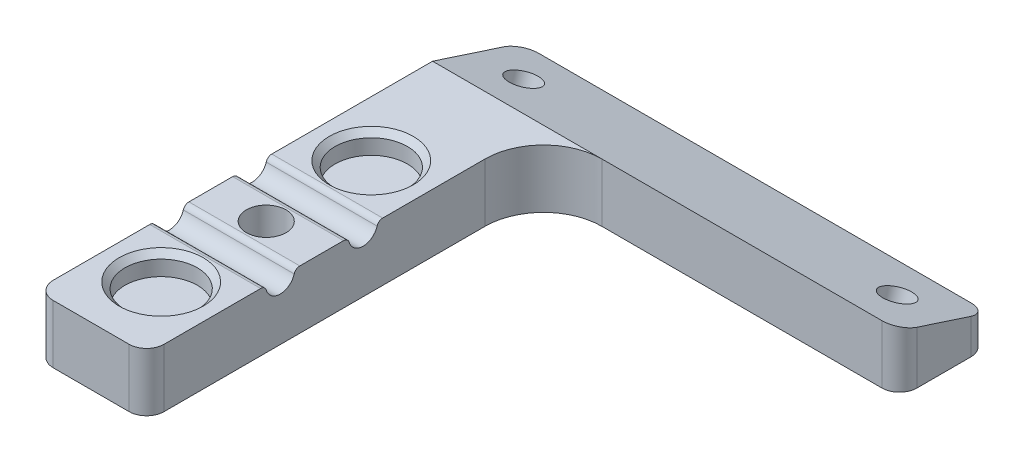
ISO-10303-21;
HEADER;
FILE_DESCRIPTION(('STEP AP214'),'2;1');
FILE_NAME('part.step','',(''),(''),'','','');
FILE_SCHEMA(('AUTOMOTIVE_DESIGN { 1 0 10303 214 1 1 1 1 }'));
ENDSEC;
DATA;
#1=APPLICATION_CONTEXT('core data for automotive mechanical design processes');
#2=APPLICATION_PROTOCOL_DEFINITION('international standard','automotive_design',2000,#1);
#3=PRODUCT_CONTEXT('',#1,'mechanical');
#4=PRODUCT('Part','Part','',(#3));
#5=PRODUCT_RELATED_PRODUCT_CATEGORY('part','',(#4));
#6=PRODUCT_DEFINITION_FORMATION('','',#4);
#7=PRODUCT_DEFINITION_CONTEXT('part definition',#1,'design');
#8=PRODUCT_DEFINITION('design','',#6,#7);
#9=PRODUCT_DEFINITION_SHAPE('','',#8);
#10=(LENGTH_UNIT() NAMED_UNIT(*) SI_UNIT(.MILLI.,.METRE.));
#11=(NAMED_UNIT(*) PLANE_ANGLE_UNIT() SI_UNIT($,.RADIAN.));
#12=(NAMED_UNIT(*) SI_UNIT($,.STERADIAN.) SOLID_ANGLE_UNIT());
#13=UNCERTAINTY_MEASURE_WITH_UNIT(LENGTH_MEASURE(1.E-05),#10,'distance_accuracy_value','');
#14=(GEOMETRIC_REPRESENTATION_CONTEXT(3) GLOBAL_UNCERTAINTY_ASSIGNED_CONTEXT((#13)) GLOBAL_UNIT_ASSIGNED_CONTEXT((#10,
#11,#12)) REPRESENTATION_CONTEXT('',''));
#15=CARTESIAN_POINT('',(0.,0.,0.));
#16=DIRECTION('',(0.,0.,1.));
#17=DIRECTION('',(1.,0.,0.));
#18=AXIS2_PLACEMENT_3D('',#15,#16,#17);
#19=CARTESIAN_POINT('',(0.,5.,0.));
#20=DIRECTION('',(0.,-1.,0.));
#21=DIRECTION('',(0.,0.,-1.));
#22=AXIS2_PLACEMENT_3D('',#19,#20,#21);
#23=PLANE('',#22);
#24=CARTESIAN_POINT('',(0.,5.,9.));
#25=DIRECTION('',(0.,-1.,0.));
#26=DIRECTION('',(0.,0.,-1.));
#27=AXIS2_PLACEMENT_3D('',#24,#25,#26);
#28=CIRCLE('',#27,3.60000000000001);
#29=CARTESIAN_POINT('',(0.,5.,5.4));
#30=VERTEX_POINT('',#29);
#31=EDGE_CURVE('E249',#30,#30,#28,.T.);
#32=ORIENTED_EDGE('',*,*,#31,.T.);
#33=EDGE_LOOP('',(#32));
#34=FACE_BOUND('',#33,.T.);
#35=DIRECTION('',(0.,0.,-1.));
#36=VECTOR('',#35,1.);
#37=CARTESIAN_POINT('',(4.75,5.,15.));
#38=LINE('',#37,#36);
#39=CARTESIAN_POINT('',(4.75,5.,13.5));
#40=VERTEX_POINT('',#39);
#41=CARTESIAN_POINT('',(4.75,5.,5.22705098312484));
#42=VERTEX_POINT('',#41);
#43=EDGE_CURVE('E214',#40,#42,#38,.T.);
#44=ORIENTED_EDGE('',*,*,#43,.T.);
#45=DIRECTION('',(-1.,0.,0.));
#46=VECTOR('',#45,1.);
#47=CARTESIAN_POINT('',(0.,5.,5.22705098312484));
#48=LINE('',#47,#46);
#49=CARTESIAN_POINT('',(-4.75,5.,5.22705098312484));
#50=VERTEX_POINT('',#49);
#51=EDGE_CURVE('E314',#42,#50,#48,.T.);
#52=ORIENTED_EDGE('',*,*,#51,.T.);
#53=DIRECTION('',(0.,0.,1.));
#54=VECTOR('',#53,1.);
#55=CARTESIAN_POINT('',(-4.75,5.,15.));
#56=LINE('',#55,#54);
#57=CARTESIAN_POINT('',(-4.75,5.,13.5));
#58=VERTEX_POINT('',#57);
#59=EDGE_CURVE('E208',#50,#58,#56,.T.);
#60=ORIENTED_EDGE('',*,*,#59,.T.);
#61=CARTESIAN_POINT('',(-3.25,5.,13.5));
#62=DIRECTION('',(0.,-1.,0.));
#63=DIRECTION('',(0.,0.,-1.));
#64=AXIS2_PLACEMENT_3D('',#61,#62,#63);
#65=CIRCLE('',#64,1.5);
#66=CARTESIAN_POINT('',(-3.25,5.,15.));
#67=VERTEX_POINT('',#66);
#68=EDGE_CURVE('E293',#58,#67,#65,.F.);
#69=ORIENTED_EDGE('',*,*,#68,.T.);
#70=DIRECTION('',(1.,0.,0.));
#71=VECTOR('',#70,1.);
#72=CARTESIAN_POINT('',(-4.75,5.,15.));
#73=LINE('',#72,#71);
#74=CARTESIAN_POINT('',(3.25,5.,15.));
#75=VERTEX_POINT('',#74);
#76=EDGE_CURVE('E205',#67,#75,#73,.T.);
#77=ORIENTED_EDGE('',*,*,#76,.T.);
#78=CARTESIAN_POINT('',(3.25,5.,13.5));
#79=DIRECTION('',(0.,-1.,0.));
#80=DIRECTION('',(0.,0.,-1.));
#81=AXIS2_PLACEMENT_3D('',#78,#79,#80);
#82=CIRCLE('',#81,1.5);
#83=EDGE_CURVE('E291',#75,#40,#82,.F.);
#84=ORIENTED_EDGE('',*,*,#83,.T.);
#85=EDGE_LOOP('',(#44,#52,#60,#69,#77,#84));
#86=FACE_BOUND('',#85,.T.);
#87=ADVANCED_FACE('F36',(#34,#86),#23,.F.);
#88=CARTESIAN_POINT('',(0.,5.,0.));
#89=DIRECTION('',(0.,1.,0.));
#90=DIRECTION('',(0.,0.,1.));
#91=AXIS2_PLACEMENT_3D('',#88,#89,#90);
#92=CIRCLE('',#91,1.7);
#93=CARTESIAN_POINT('',(0.,5.,1.7));
#94=VERTEX_POINT('',#93);
#95=EDGE_CURVE('E371',#94,#94,#92,.T.);
#96=ORIENTED_EDGE('',*,*,#95,.F.);
#97=EDGE_LOOP('',(#96));
#98=FACE_BOUND('',#97,.T.);
#99=CARTESIAN_POINT('',(-4.75,5.,-1.87294901687516));
#100=VERTEX_POINT('',#99);
#101=CARTESIAN_POINT('',(-4.75,5.,1.87294901687516));
#102=VERTEX_POINT('',#101);
#103=EDGE_CURVE('E206',#100,#102,#56,.T.);
#104=ORIENTED_EDGE('',*,*,#103,.T.);
#105=DIRECTION('',(-1.,0.,0.));
#106=VECTOR('',#105,1.);
#107=CARTESIAN_POINT('',(0.,5.,1.87294901687516));
#108=LINE('',#107,#106);
#109=CARTESIAN_POINT('',(4.75,5.,1.87294901687516));
#110=VERTEX_POINT('',#109);
#111=EDGE_CURVE('E337',#102,#110,#108,.F.);
#112=ORIENTED_EDGE('',*,*,#111,.T.);
#113=CARTESIAN_POINT('',(4.75,5.,-1.87294901687516));
#114=VERTEX_POINT('',#113);
#115=EDGE_CURVE('E219',#110,#114,#38,.T.);
#116=ORIENTED_EDGE('',*,*,#115,.T.);
#117=DIRECTION('',(-1.,0.,0.));
#118=VECTOR('',#117,1.);
#119=CARTESIAN_POINT('',(0.,5.,-1.87294901687516));
#120=LINE('',#119,#118);
#121=EDGE_CURVE('E334',#114,#100,#120,.T.);
#122=ORIENTED_EDGE('',*,*,#121,.T.);
#123=EDGE_LOOP('',(#104,#112,#116,#122));
#124=FACE_BOUND('',#123,.T.);
#125=ADVANCED_FACE('F380',(#98,#124),#23,.F.);
#126=CARTESIAN_POINT('',(0.,0.,0.));
#127=DIRECTION('',(0.,1.,0.));
#128=DIRECTION('',(0.,0.,1.));
#129=AXIS2_PLACEMENT_3D('',#126,#127,#128);
#130=CYLINDRICAL_SURFACE('',#129,1.7);
#131=ORIENTED_EDGE('',*,*,#95,.T.);
#132=EDGE_LOOP('',(#131));
#133=FACE_BOUND('',#132,.T.);
#134=CARTESIAN_POINT('',(0.,2.,0.));
#135=DIRECTION('',(0.,-1.,0.));
#136=DIRECTION('',(0.,0.,-1.));
#137=AXIS2_PLACEMENT_3D('',#134,#135,#136);
#138=CIRCLE('',#137,1.7);
#139=CARTESIAN_POINT('',(0.,2.,-1.7));
#140=VERTEX_POINT('',#139);
#141=EDGE_CURVE('E307',#140,#140,#138,.F.);
#142=ORIENTED_EDGE('',*,*,#141,.F.);
#143=EDGE_LOOP('',(#142));
#144=FACE_BOUND('',#143,.T.);
#145=ADVANCED_FACE('F377',(#133,#144),#130,.F.);
#146=CARTESIAN_POINT('',(0.,0.,-9.));
#147=DIRECTION('',(0.,1.,0.));
#148=DIRECTION('',(0.,0.,1.));
#149=AXIS2_PLACEMENT_3D('',#146,#147,#148);
#150=CYLINDRICAL_SURFACE('',#149,3.1);
#151=CARTESIAN_POINT('',(0.,4.5,-9.));
#152=DIRECTION('',(0.,-1.,0.));
#153=DIRECTION('',(0.,0.,-1.));
#154=AXIS2_PLACEMENT_3D('',#151,#152,#153);
#155=CIRCLE('',#154,3.1);
#156=CARTESIAN_POINT('',(0.,4.5,-12.1));
#157=VERTEX_POINT('',#156);
#158=EDGE_CURVE('E252',#157,#157,#155,.F.);
#159=ORIENTED_EDGE('',*,*,#158,.T.);
#160=EDGE_LOOP('',(#159));
#161=FACE_BOUND('',#160,.T.);
#162=CARTESIAN_POINT('',(0.,3.2,-9.));
#163=DIRECTION('',(0.,-1.,0.));
#164=DIRECTION('',(0.,0.,-1.));
#165=AXIS2_PLACEMENT_3D('',#162,#163,#164);
#166=CIRCLE('',#165,3.1);
#167=CARTESIAN_POINT('',(0.,3.2,-12.1));
#168=VERTEX_POINT('',#167);
#169=EDGE_CURVE('E240',#168,#168,#166,.F.);
#170=ORIENTED_EDGE('',*,*,#169,.F.);
#171=EDGE_LOOP('',(#170));
#172=FACE_BOUND('',#171,.T.);
#173=ADVANCED_FACE('F485',(#161,#172),#150,.F.);
#174=CARTESIAN_POINT('',(0.,0.,9.));
#175=DIRECTION('',(0.,1.,0.));
#176=DIRECTION('',(0.,0.,1.));
#177=AXIS2_PLACEMENT_3D('',#174,#175,#176);
#178=CYLINDRICAL_SURFACE('',#177,3.1);
#179=CARTESIAN_POINT('',(0.,4.5,9.));
#180=DIRECTION('',(0.,-1.,0.));
#181=DIRECTION('',(0.,0.,-1.));
#182=AXIS2_PLACEMENT_3D('',#179,#180,#181);
#183=CIRCLE('',#182,3.1);
#184=CARTESIAN_POINT('',(0.,4.5,5.9));
#185=VERTEX_POINT('',#184);
#186=EDGE_CURVE('E243',#185,#185,#183,.F.);
#187=ORIENTED_EDGE('',*,*,#186,.T.);
#188=EDGE_LOOP('',(#187));
#189=FACE_BOUND('',#188,.T.);
#190=CARTESIAN_POINT('',(0.,3.2,9.));
#191=DIRECTION('',(0.,-1.,0.));
#192=DIRECTION('',(0.,0.,-1.));
#193=AXIS2_PLACEMENT_3D('',#190,#191,#192);
#194=CIRCLE('',#193,3.1);
#195=CARTESIAN_POINT('',(0.,3.2,5.9));
#196=VERTEX_POINT('',#195);
#197=EDGE_CURVE('E210',#196,#196,#194,.F.);
#198=ORIENTED_EDGE('',*,*,#197,.F.);
#199=EDGE_LOOP('',(#198));
#200=FACE_BOUND('',#199,.T.);
#201=ADVANCED_FACE('F488',(#189,#200),#178,.F.);
#202=CARTESIAN_POINT('',(4.75,5.,15.));
#203=DIRECTION('',(-1.,0.,0.));
#204=DIRECTION('',(0.,0.,1.));
#205=AXIS2_PLACEMENT_3D('',#202,#203,#204);
#206=PLANE('',#205);
#207=CARTESIAN_POINT('',(4.75,5.,3.55));
#208=DIRECTION('',(-1.,0.,0.));
#209=DIRECTION('',(0.,0.,1.));
#210=AXIS2_PLACEMENT_3D('',#207,#208,#209);
#211=CIRCLE('',#210,1.25);
#212=CARTESIAN_POINT('',(4.75,4.64285714285714,2.35210644062511));
#213=VERTEX_POINT('',#212);
#214=CARTESIAN_POINT('',(4.75,4.64285714285714,4.74789355937489));
#215=VERTEX_POINT('',#214);
#216=EDGE_CURVE('E347',#213,#215,#211,.T.);
#217=ORIENTED_EDGE('',*,*,#216,.T.);
#218=CARTESIAN_POINT('',(4.75,4.5,5.22705098312484));
#219=DIRECTION('',(-1.,0.,0.));
#220=DIRECTION('',(0.,0.,1.));
#221=AXIS2_PLACEMENT_3D('',#218,#219,#220);
#222=CIRCLE('',#221,0.5);
#223=EDGE_CURVE('E332',#215,#42,#222,.F.);
#224=ORIENTED_EDGE('',*,*,#223,.T.);
#225=ORIENTED_EDGE('',*,*,#43,.F.);
#226=DIRECTION('',(0.,-1.,0.));
#227=VECTOR('',#226,1.);
#228=CARTESIAN_POINT('',(4.75,5.,13.5));
#229=LINE('',#228,#227);
#230=CARTESIAN_POINT('',(4.75,0.,13.5));
#231=VERTEX_POINT('',#230);
#232=EDGE_CURVE('E295',#40,#231,#229,.T.);
#233=ORIENTED_EDGE('',*,*,#232,.T.);
#234=DIRECTION('',(0.,0.,-1.));
#235=VECTOR('',#234,1.);
#236=CARTESIAN_POINT('',(4.75,0.,15.));
#237=LINE('',#236,#235);
#238=CARTESIAN_POINT('',(4.75,0.,-14.));
#239=VERTEX_POINT('',#238);
#240=EDGE_CURVE('E234',#231,#239,#237,.T.);
#241=ORIENTED_EDGE('',*,*,#240,.T.);
#242=DIRECTION('',(0.,1.,0.));
#243=VECTOR('',#242,1.);
#244=CARTESIAN_POINT('',(4.75,5.,-14.));
#245=LINE('',#244,#243);
#246=CARTESIAN_POINT('',(4.75,5.,-14.));
#247=VERTEX_POINT('',#246);
#248=EDGE_CURVE('E298',#239,#247,#245,.T.);
#249=ORIENTED_EDGE('',*,*,#248,.T.);
#250=CARTESIAN_POINT('',(4.75,5.,-5.22705098312484));
#251=VERTEX_POINT('',#250);
#252=EDGE_CURVE('E220',#251,#247,#38,.T.);
#253=ORIENTED_EDGE('',*,*,#252,.F.);
#254=CARTESIAN_POINT('',(4.75,4.5,-5.22705098312484));
#255=DIRECTION('',(-1.,0.,0.));
#256=DIRECTION('',(0.,0.,1.));
#257=AXIS2_PLACEMENT_3D('',#254,#255,#256);
#258=CIRCLE('',#257,0.5);
#259=CARTESIAN_POINT('',(4.75,4.64285714285714,-4.74789355937489));
#260=VERTEX_POINT('',#259);
#261=EDGE_CURVE('E57',#251,#260,#258,.F.);
#262=ORIENTED_EDGE('',*,*,#261,.T.);
#263=CARTESIAN_POINT('',(4.75,5.,-3.55));
#264=DIRECTION('',(-1.,0.,0.));
#265=DIRECTION('',(0.,0.,1.));
#266=AXIS2_PLACEMENT_3D('',#263,#264,#265);
#267=CIRCLE('',#266,1.25);
#268=CARTESIAN_POINT('',(4.75,4.64285714285714,-2.35210644062511));
#269=VERTEX_POINT('',#268);
#270=EDGE_CURVE('E344',#260,#269,#267,.T.);
#271=ORIENTED_EDGE('',*,*,#270,.T.);
#272=CARTESIAN_POINT('',(4.75,4.5,-1.87294901687516));
#273=DIRECTION('',(-1.,0.,0.));
#274=DIRECTION('',(0.,0.,1.));
#275=AXIS2_PLACEMENT_3D('',#272,#273,#274);
#276=CIRCLE('',#275,0.5);
#277=EDGE_CURVE('E328',#269,#114,#276,.F.);
#278=ORIENTED_EDGE('',*,*,#277,.T.);
#279=ORIENTED_EDGE('',*,*,#115,.F.);
#280=CARTESIAN_POINT('',(4.75,4.5,1.87294901687516));
#281=DIRECTION('',(-1.,0.,0.));
#282=DIRECTION('',(0.,0.,1.));
#283=AXIS2_PLACEMENT_3D('',#280,#281,#282);
#284=CIRCLE('',#283,0.5);
#285=EDGE_CURVE('E330',#110,#213,#284,.F.);
#286=ORIENTED_EDGE('',*,*,#285,.T.);
#287=EDGE_LOOP('',(#217,#224,#225,#233,#241,#249,#253,#262,#271,#278,#279,#286));
#288=FACE_BOUND('',#287,.T.);
#289=ADVANCED_FACE('F350',(#288),#206,.F.);
#290=CARTESIAN_POINT('',(-4.75,5.,15.));
#291=DIRECTION('',(1.,0.,0.));
#292=DIRECTION('',(0.,0.,-1.));
#293=AXIS2_PLACEMENT_3D('',#290,#291,#292);
#294=PLANE('',#293);
#295=ORIENTED_EDGE('',*,*,#59,.F.);
#296=CARTESIAN_POINT('',(-4.75,4.5,5.22705098312484));
#297=DIRECTION('',(1.,0.,0.));
#298=DIRECTION('',(0.,0.,-1.));
#299=AXIS2_PLACEMENT_3D('',#296,#297,#298);
#300=CIRCLE('',#299,0.5);
#301=CARTESIAN_POINT('',(-4.75,4.64285714285714,4.74789355937489));
#302=VERTEX_POINT('',#301);
#303=EDGE_CURVE('E321',#50,#302,#300,.F.);
#304=ORIENTED_EDGE('',*,*,#303,.T.);
#305=CARTESIAN_POINT('',(-4.75,5.,3.55));
#306=DIRECTION('',(1.,0.,0.));
#307=DIRECTION('',(0.,0.,-1.));
#308=AXIS2_PLACEMENT_3D('',#305,#306,#307);
#309=CIRCLE('',#308,1.25);
#310=CARTESIAN_POINT('',(-4.75,4.64285714285714,2.35210644062511));
#311=VERTEX_POINT('',#310);
#312=EDGE_CURVE('E306',#302,#311,#309,.T.);
#313=ORIENTED_EDGE('',*,*,#312,.T.);
#314=CARTESIAN_POINT('',(-4.75,4.5,1.87294901687516));
#315=DIRECTION('',(1.,0.,0.));
#316=DIRECTION('',(0.,0.,-1.));
#317=AXIS2_PLACEMENT_3D('',#314,#315,#316);
#318=CIRCLE('',#317,0.5);
#319=EDGE_CURVE('E319',#311,#102,#318,.F.);
#320=ORIENTED_EDGE('',*,*,#319,.T.);
#321=ORIENTED_EDGE('',*,*,#103,.F.);
#322=CARTESIAN_POINT('',(-4.75,4.5,-1.87294901687516));
#323=DIRECTION('',(1.,0.,0.));
#324=DIRECTION('',(0.,0.,-1.));
#325=AXIS2_PLACEMENT_3D('',#322,#323,#324);
#326=CIRCLE('',#325,0.5);
#327=CARTESIAN_POINT('',(-4.75,4.64285714285714,-2.35210644062511));
#328=VERTEX_POINT('',#327);
#329=EDGE_CURVE('E317',#100,#328,#326,.F.);
#330=ORIENTED_EDGE('',*,*,#329,.T.);
#331=CARTESIAN_POINT('',(-4.75,5.,-3.55));
#332=DIRECTION('',(-1.,0.,0.));
#333=DIRECTION('',(0.,0.,1.));
#334=AXIS2_PLACEMENT_3D('',#331,#332,#333);
#335=CIRCLE('',#334,1.25);
#336=CARTESIAN_POINT('',(-4.75,4.64285714285714,-4.74789355937489));
#337=VERTEX_POINT('',#336);
#338=EDGE_CURVE('E343',#337,#328,#335,.T.);
#339=ORIENTED_EDGE('',*,*,#338,.F.);
#340=CARTESIAN_POINT('',(-4.75,4.5,-5.22705098312484));
#341=DIRECTION('',(1.,0.,0.));
#342=DIRECTION('',(0.,0.,-1.));
#343=AXIS2_PLACEMENT_3D('',#340,#341,#342);
#344=CIRCLE('',#343,0.5);
#345=CARTESIAN_POINT('',(-4.75,5.,-5.22705098312484));
#346=VERTEX_POINT('',#345);
#347=EDGE_CURVE('E204',#337,#346,#344,.F.);
#348=ORIENTED_EDGE('',*,*,#347,.T.);
#349=CARTESIAN_POINT('',(-4.75,5.,-19.));
#350=VERTEX_POINT('',#349);
#351=EDGE_CURVE('E193',#350,#346,#56,.T.);
#352=ORIENTED_EDGE('',*,*,#351,.F.);
#353=DIRECTION('',(0.,-0.309016994374941,-0.951056516295156));
#354=VECTOR('',#353,1.);
#355=CARTESIAN_POINT('',(-4.75,5.,-19.));
#356=LINE('',#355,#354);
#357=CARTESIAN_POINT('',(-4.75,3.01524358934982,-25.1084521303613));
#358=VERTEX_POINT('',#357);
#359=EDGE_CURVE('E175',#350,#358,#356,.T.);
#360=ORIENTED_EDGE('',*,*,#359,.T.);
#361=DIRECTION('',(0.,-1.,0.));
#362=VECTOR('',#361,1.);
#363=CARTESIAN_POINT('',(-4.75,5.,-25.1084521303613));
#364=LINE('',#363,#362);
#365=CARTESIAN_POINT('',(-4.75,0.,-25.1084521303613));
#366=VERTEX_POINT('',#365);
#367=EDGE_CURVE('E257',#358,#366,#364,.T.);
#368=ORIENTED_EDGE('',*,*,#367,.T.);
#369=DIRECTION('',(0.,0.,1.));
#370=VECTOR('',#369,1.);
#371=CARTESIAN_POINT('',(-4.75,0.,15.));
#372=LINE('',#371,#370);
#373=CARTESIAN_POINT('',(-4.75,0.,13.5));
#374=VERTEX_POINT('',#373);
#375=EDGE_CURVE('E227',#366,#374,#372,.T.);
#376=ORIENTED_EDGE('',*,*,#375,.T.);
#377=DIRECTION('',(0.,-1.,0.));
#378=VECTOR('',#377,1.);
#379=CARTESIAN_POINT('',(-4.75,5.,13.5));
#380=LINE('',#379,#378);
#381=EDGE_CURVE('E255',#374,#58,#380,.F.);
#382=ORIENTED_EDGE('',*,*,#381,.T.);
#383=EDGE_LOOP('',(#295,#304,#313,#320,#321,#330,#339,#348,#352,#360,#368,#376,#382));
#384=FACE_BOUND('',#383,.T.);
#385=ADVANCED_FACE('F201',(#384),#294,.F.);
#386=CARTESIAN_POINT('',(-4.75,5.,15.));
#387=DIRECTION('',(0.,0.,-1.));
#388=DIRECTION('',(-1.,0.,0.));
#389=AXIS2_PLACEMENT_3D('',#386,#387,#388);
#390=PLANE('',#389);
#391=ORIENTED_EDGE('',*,*,#76,.F.);
#392=DIRECTION('',(0.,-1.,0.));
#393=VECTOR('',#392,1.);
#394=CARTESIAN_POINT('',(-3.25,5.,15.));
#395=LINE('',#394,#393);
#396=CARTESIAN_POINT('',(-3.25,0.,15.));
#397=VERTEX_POINT('',#396);
#398=EDGE_CURVE('E289',#67,#397,#395,.T.);
#399=ORIENTED_EDGE('',*,*,#398,.T.);
#400=DIRECTION('',(1.,0.,0.));
#401=VECTOR('',#400,1.);
#402=CARTESIAN_POINT('',(-4.75,0.,15.));
#403=LINE('',#402,#401);
#404=CARTESIAN_POINT('',(3.25,0.,15.));
#405=VERTEX_POINT('',#404);
#406=EDGE_CURVE('E225',#397,#405,#403,.T.);
#407=ORIENTED_EDGE('',*,*,#406,.T.);
#408=DIRECTION('',(0.,-1.,0.));
#409=VECTOR('',#408,1.);
#410=CARTESIAN_POINT('',(3.25,5.,15.));
#411=LINE('',#410,#409);
#412=EDGE_CURVE('E287',#405,#75,#411,.F.);
#413=ORIENTED_EDGE('',*,*,#412,.T.);
#414=EDGE_LOOP('',(#391,#399,#407,#413));
#415=FACE_BOUND('',#414,.T.);
#416=ADVANCED_FACE('F445',(#415),#390,.F.);
#417=CARTESIAN_POINT('',(0.,5.,-9.));
#418=DIRECTION('',(0.,-1.,0.));
#419=DIRECTION('',(0.,0.,-1.));
#420=AXIS2_PLACEMENT_3D('',#417,#418,#419);
#421=CIRCLE('',#420,3.60000000000001);
#422=CARTESIAN_POINT('',(0.,5.,-12.6));
#423=VERTEX_POINT('',#422);
#424=EDGE_CURVE('E246',#423,#423,#421,.T.);
#425=ORIENTED_EDGE('',*,*,#424,.T.);
#426=EDGE_LOOP('',(#425));
#427=FACE_BOUND('',#426,.T.);
#428=ORIENTED_EDGE('',*,*,#351,.T.);
#429=DIRECTION('',(-1.,0.,0.));
#430=VECTOR('',#429,1.);
#431=CARTESIAN_POINT('',(0.,5.,-5.22705098312484));
#432=LINE('',#431,#430);
#433=EDGE_CURVE('E12',#346,#251,#432,.F.);
#434=ORIENTED_EDGE('',*,*,#433,.T.);
#435=ORIENTED_EDGE('',*,*,#252,.T.);
#436=CARTESIAN_POINT('',(9.75,5.,-14.));
#437=DIRECTION('',(0.,-1.,0.));
#438=DIRECTION('',(0.,0.,-1.));
#439=AXIS2_PLACEMENT_3D('',#436,#437,#438);
#440=CIRCLE('',#439,5.);
#441=CARTESIAN_POINT('',(9.75,5.,-19.));
#442=VERTEX_POINT('',#441);
#443=EDGE_CURVE('E196',#247,#442,#440,.T.);
#444=ORIENTED_EDGE('',*,*,#443,.T.);
#445=DIRECTION('',(1.,0.,0.));
#446=VECTOR('',#445,1.);
#447=CARTESIAN_POINT('',(-4.75,5.,-19.));
#448=LINE('',#447,#446);
#449=EDGE_CURVE('E179',#350,#442,#448,.T.);
#450=ORIENTED_EDGE('',*,*,#449,.F.);
#451=EDGE_LOOP('',(#428,#434,#435,#444,#450));
#452=FACE_BOUND('',#451,.T.);
#453=ADVANCED_FACE('F192',(#427,#452),#23,.F.);
#454=CARTESIAN_POINT('',(0.,0.,0.));
#455=DIRECTION('',(0.,-1.,0.));
#456=DIRECTION('',(0.,0.,-1.));
#457=AXIS2_PLACEMENT_3D('',#454,#455,#456);
#458=PLANE('',#457);
#459=CARTESIAN_POINT('',(0.,0.,0.));
#460=DIRECTION('',(0.,-1.,0.));
#461=DIRECTION('',(0.,0.,-1.));
#462=AXIS2_PLACEMENT_3D('',#459,#460,#461);
#463=CIRCLE('',#462,3.25);
#464=CARTESIAN_POINT('',(0.,0.,-3.25));
#465=VERTEX_POINT('',#464);
#466=EDGE_CURVE('E400',#465,#465,#463,.T.);
#467=ORIENTED_EDGE('',*,*,#466,.F.);
#468=EDGE_LOOP('',(#467));
#469=FACE_BOUND('',#468,.T.);
#470=ORIENTED_EDGE('',*,*,#375,.F.);
#471=CARTESIAN_POINT('',(-3.25,0.,-25.1084521303613));
#472=DIRECTION('',(0.,-1.,0.));
#473=DIRECTION('',(0.,0.,-1.));
#474=AXIS2_PLACEMENT_3D('',#471,#472,#473);
#475=CIRCLE('',#474,1.5);
#476=CARTESIAN_POINT('',(-3.25,0.,-26.6084521303613));
#477=VERTEX_POINT('',#476);
#478=EDGE_CURVE('E268',#366,#477,#475,.T.);
#479=ORIENTED_EDGE('',*,*,#478,.T.);
#480=DIRECTION('',(1.,0.,0.));
#481=VECTOR('',#480,1.);
#482=CARTESIAN_POINT('',(-4.75,0.,-26.6084521303613));
#483=LINE('',#482,#481);
#484=CARTESIAN_POINT('',(33.75,0.,-26.6084521303613));
#485=VERTEX_POINT('',#484);
#486=EDGE_CURVE('E310',#477,#485,#483,.T.);
#487=ORIENTED_EDGE('',*,*,#486,.T.);
#488=CARTESIAN_POINT('',(33.75,0.,-25.1084521303613));
#489=DIRECTION('',(0.,-1.,0.));
#490=DIRECTION('',(0.,0.,-1.));
#491=AXIS2_PLACEMENT_3D('',#488,#489,#490);
#492=CIRCLE('',#491,1.5);
#493=CARTESIAN_POINT('',(35.25,0.,-25.1084521303613));
#494=VERTEX_POINT('',#493);
#495=EDGE_CURVE('E266',#485,#494,#492,.T.);
#496=ORIENTED_EDGE('',*,*,#495,.T.);
#497=DIRECTION('',(0.,0.,-1.));
#498=VECTOR('',#497,1.);
#499=CARTESIAN_POINT('',(35.25,0.,-29.));
#500=LINE('',#499,#498);
#501=CARTESIAN_POINT('',(35.25,0.,-20.5));
#502=VERTEX_POINT('',#501);
#503=EDGE_CURVE('E368',#502,#494,#500,.T.);
#504=ORIENTED_EDGE('',*,*,#503,.F.);
#505=CARTESIAN_POINT('',(33.75,0.,-20.5));
#506=DIRECTION('',(0.,-1.,0.));
#507=DIRECTION('',(0.,0.,-1.));
#508=AXIS2_PLACEMENT_3D('',#505,#506,#507);
#509=CIRCLE('',#508,1.5);
#510=CARTESIAN_POINT('',(33.75,0.,-19.));
#511=VERTEX_POINT('',#510);
#512=EDGE_CURVE('E263',#502,#511,#509,.T.);
#513=ORIENTED_EDGE('',*,*,#512,.T.);
#514=DIRECTION('',(1.,0.,0.));
#515=VECTOR('',#514,1.);
#516=CARTESIAN_POINT('',(4.75,0.,-19.));
#517=LINE('',#516,#515);
#518=CARTESIAN_POINT('',(9.75,0.,-19.));
#519=VERTEX_POINT('',#518);
#520=EDGE_CURVE('E360',#519,#511,#517,.T.);
#521=ORIENTED_EDGE('',*,*,#520,.F.);
#522=CARTESIAN_POINT('',(9.75,0.,-14.));
#523=DIRECTION('',(0.,-1.,0.));
#524=DIRECTION('',(0.,0.,-1.));
#525=AXIS2_PLACEMENT_3D('',#522,#523,#524);
#526=CIRCLE('',#525,5.);
#527=EDGE_CURVE('E304',#519,#239,#526,.F.);
#528=ORIENTED_EDGE('',*,*,#527,.T.);
#529=ORIENTED_EDGE('',*,*,#240,.F.);
#530=CARTESIAN_POINT('',(3.25,0.,13.5));
#531=DIRECTION('',(0.,-1.,0.));
#532=DIRECTION('',(0.,0.,-1.));
#533=AXIS2_PLACEMENT_3D('',#530,#531,#532);
#534=CIRCLE('',#533,1.5);
#535=EDGE_CURVE('E259',#231,#405,#534,.T.);
#536=ORIENTED_EDGE('',*,*,#535,.T.);
#537=ORIENTED_EDGE('',*,*,#406,.F.);
#538=CARTESIAN_POINT('',(-3.25,0.,13.5));
#539=DIRECTION('',(0.,-1.,0.));
#540=DIRECTION('',(0.,0.,-1.));
#541=AXIS2_PLACEMENT_3D('',#538,#539,#540);
#542=CIRCLE('',#541,1.5);
#543=EDGE_CURVE('E261',#397,#374,#542,.T.);
#544=ORIENTED_EDGE('',*,*,#543,.T.);
#545=EDGE_LOOP('',(#470,#479,#487,#496,#504,#513,#521,#528,#529,#536,#537,#544));
#546=FACE_BOUND('',#545,.T.);
#547=CARTESIAN_POINT('',(31.25,0.,-21.5812504157886));
#548=DIRECTION('',(0.,-1.,0.));
#549=DIRECTION('',(0.,0.,-1.));
#550=AXIS2_PLACEMENT_3D('',#547,#548,#549);
#551=ELLIPSE('',#550,1.36690089150974,1.3);
#552=CARTESIAN_POINT('',(31.25,0.,-22.9481513072983));
#553=VERTEX_POINT('',#552);
#554=EDGE_CURVE('E413',#553,#553,#551,.T.);
#555=ORIENTED_EDGE('',*,*,#554,.F.);
#556=EDGE_LOOP('',(#555));
#557=FACE_BOUND('',#556,.T.);
#558=CARTESIAN_POINT('',(-0.750000000000004,0.,-21.5812504157886));
#559=DIRECTION('',(0.,-1.,0.));
#560=DIRECTION('',(0.,0.,-1.));
#561=AXIS2_PLACEMENT_3D('',#558,#559,#560);
#562=ELLIPSE('',#561,1.36690089150974,1.3);
#563=CARTESIAN_POINT('',(-0.750000000000004,0.,-22.9481513072983));
#564=VERTEX_POINT('',#563);
#565=EDGE_CURVE('E419',#564,#564,#562,.T.);
#566=ORIENTED_EDGE('',*,*,#565,.F.);
#567=EDGE_LOOP('',(#566));
#568=FACE_BOUND('',#567,.T.);
#569=ADVANCED_FACE('F363',(#469,#546,#557,#568),#458,.T.);
#570=CARTESIAN_POINT('',(0.,3.2,0.));
#571=DIRECTION('',(0.,-1.,0.));
#572=DIRECTION('',(0.,0.,-1.));
#573=AXIS2_PLACEMENT_3D('',#570,#571,#572);
#574=PLANE('',#573);
#575=ORIENTED_EDGE('',*,*,#197,.T.);
#576=EDGE_LOOP('',(#575));
#577=FACE_BOUND('',#576,.T.);
#578=ADVANCED_FACE('F473',(#577),#574,.F.);
#579=CARTESIAN_POINT('',(0.,3.2,0.));
#580=DIRECTION('',(0.,-1.,0.));
#581=DIRECTION('',(0.,0.,-1.));
#582=AXIS2_PLACEMENT_3D('',#579,#580,#581);
#583=PLANE('',#582);
#584=ORIENTED_EDGE('',*,*,#169,.T.);
#585=EDGE_LOOP('',(#584));
#586=FACE_BOUND('',#585,.T.);
#587=ADVANCED_FACE('F491',(#586),#583,.F.);
#588=CARTESIAN_POINT('',(0.,4.5,9.));
#589=DIRECTION('',(0.,1.,0.));
#590=DIRECTION('',(0.,0.,1.));
#591=AXIS2_PLACEMENT_3D('',#588,#589,#590);
#592=CONICAL_SURFACE('',#591,3.1,0.78539816339745);
#593=ORIENTED_EDGE('',*,*,#31,.F.);
#594=EDGE_LOOP('',(#593));
#595=FACE_BOUND('',#594,.T.);
#596=ORIENTED_EDGE('',*,*,#186,.F.);
#597=EDGE_LOOP('',(#596));
#598=FACE_BOUND('',#597,.T.);
#599=ADVANCED_FACE('F481',(#595,#598),#592,.F.);
#600=CARTESIAN_POINT('',(0.,4.5,-9.));
#601=DIRECTION('',(0.,1.,0.));
#602=DIRECTION('',(0.,0.,1.));
#603=AXIS2_PLACEMENT_3D('',#600,#601,#602);
#604=CONICAL_SURFACE('',#603,3.1,0.78539816339745);
#605=ORIENTED_EDGE('',*,*,#424,.F.);
#606=EDGE_LOOP('',(#605));
#607=FACE_BOUND('',#606,.T.);
#608=ORIENTED_EDGE('',*,*,#158,.F.);
#609=EDGE_LOOP('',(#608));
#610=FACE_BOUND('',#609,.T.);
#611=ADVANCED_FACE('F478',(#607,#610),#604,.F.);
#612=CARTESIAN_POINT('',(4.75,-42.3792402008342,-19.));
#613=DIRECTION('',(0.,0.,1.));
#614=DIRECTION('',(1.,0.,0.));
#615=AXIS2_PLACEMENT_3D('',#612,#613,#614);
#616=PLANE('',#615);
#617=DIRECTION('',(1.,0.,0.));
#618=VECTOR('',#617,1.);
#619=CARTESIAN_POINT('',(4.75,5.,-19.));
#620=LINE('',#619,#618);
#621=CARTESIAN_POINT('',(33.75,5.,-19.));
#622=VERTEX_POINT('',#621);
#623=EDGE_CURVE('E198',#442,#622,#620,.T.);
#624=ORIENTED_EDGE('',*,*,#623,.F.);
#625=DIRECTION('',(0.,1.,0.));
#626=VECTOR('',#625,1.);
#627=CARTESIAN_POINT('',(9.75,-42.3792402008342,-19.));
#628=LINE('',#627,#626);
#629=EDGE_CURVE('E301',#442,#519,#628,.F.);
#630=ORIENTED_EDGE('',*,*,#629,.T.);
#631=ORIENTED_EDGE('',*,*,#520,.T.);
#632=DIRECTION('',(0.,1.,0.));
#633=VECTOR('',#632,1.);
#634=CARTESIAN_POINT('',(33.75,-42.3792402008342,-19.));
#635=LINE('',#634,#633);
#636=EDGE_CURVE('E284',#511,#622,#635,.T.);
#637=ORIENTED_EDGE('',*,*,#636,.T.);
#638=EDGE_LOOP('',(#624,#630,#631,#637));
#639=FACE_BOUND('',#638,.T.);
#640=ADVANCED_FACE('F359',(#639),#616,.T.);
#641=CARTESIAN_POINT('',(35.25,-42.3792402008342,-29.));
#642=DIRECTION('',(1.,0.,0.));
#643=DIRECTION('',(0.,0.,-1.));
#644=AXIS2_PLACEMENT_3D('',#641,#642,#643);
#645=PLANE('',#644);
#646=ORIENTED_EDGE('',*,*,#503,.T.);
#647=DIRECTION('',(0.,-1.,0.));
#648=VECTOR('',#647,1.);
#649=CARTESIAN_POINT('',(35.25,2.52786404500047,-25.1084521303613));
#650=LINE('',#649,#648);
#651=CARTESIAN_POINT('',(35.25,3.01524358934982,-25.1084521303613));
#652=VERTEX_POINT('',#651);
#653=EDGE_CURVE('E282',#494,#652,#650,.F.);
#654=ORIENTED_EDGE('',*,*,#653,.T.);
#655=DIRECTION('',(0.,-0.309016994374941,-0.951056516295156));
#656=VECTOR('',#655,1.);
#657=CARTESIAN_POINT('',(35.25,5.,-19.));
#658=LINE('',#657,#656);
#659=CARTESIAN_POINT('',(35.25,4.51262045565065,-20.5));
#660=VERTEX_POINT('',#659);
#661=EDGE_CURVE('E187',#660,#652,#658,.T.);
#662=ORIENTED_EDGE('',*,*,#661,.F.);
#663=DIRECTION('',(0.,1.,0.));
#664=VECTOR('',#663,1.);
#665=CARTESIAN_POINT('',(35.25,-42.3792402008342,-20.5));
#666=LINE('',#665,#664);
#667=EDGE_CURVE('E280',#660,#502,#666,.F.);
#668=ORIENTED_EDGE('',*,*,#667,.T.);
#669=EDGE_LOOP('',(#646,#654,#662,#668));
#670=FACE_BOUND('',#669,.T.);
#671=ADVANCED_FACE('F553',(#670),#645,.T.);
#672=CARTESIAN_POINT('',(-4.75,5.,-19.));
#673=DIRECTION('',(0.,-0.951056516295156,0.309016994374941));
#674=DIRECTION('',(0.,-0.309016994374941,-0.951056516295156));
#675=AXIS2_PLACEMENT_3D('',#672,#673,#674);
#676=PLANE('',#675);
#677=CARTESIAN_POINT('',(31.25,3.76393202250024,-22.8042260651806));
#678=DIRECTION('',(0.,0.951056516295156,-0.309016994374941));
#679=DIRECTION('',(0.,0.309016994374941,0.951056516295156));
#680=AXIS2_PLACEMENT_3D('',#677,#678,#679);
#681=CIRCLE('',#680,1.3);
#682=CARTESIAN_POINT('',(31.25,4.16565411518766,-21.5678525939969));
#683=VERTEX_POINT('',#682);
#684=EDGE_CURVE('E408',#683,#683,#681,.T.);
#685=ORIENTED_EDGE('',*,*,#684,.F.);
#686=EDGE_LOOP('',(#685));
#687=FACE_BOUND('',#686,.T.);
#688=CARTESIAN_POINT('',(-0.750000000000004,3.76393202250024,-22.8042260651806));
#689=DIRECTION('',(0.,0.951056516295156,-0.309016994374941));
#690=DIRECTION('',(0.,0.309016994374941,0.951056516295156));
#691=AXIS2_PLACEMENT_3D('',#688,#689,#690);
#692=CIRCLE('',#691,1.3);
#693=CARTESIAN_POINT('',(-0.750000000000004,4.16565411518766,-21.5678525939969));
#694=VERTEX_POINT('',#693);
#695=EDGE_CURVE('E416',#694,#694,#692,.T.);
#696=ORIENTED_EDGE('',*,*,#695,.F.);
#697=EDGE_LOOP('',(#696));
#698=FACE_BOUND('',#697,.T.);
#699=DIRECTION('',(1.,0.,0.));
#700=VECTOR('',#699,1.);
#701=CARTESIAN_POINT('',(-4.75,2.52786404500047,-26.6084521303613));
#702=LINE('',#701,#700);
#703=CARTESIAN_POINT('',(-3.25,2.52786404500047,-26.6084521303613));
#704=VERTEX_POINT('',#703);
#705=CARTESIAN_POINT('',(33.75,2.52786404500047,-26.6084521303613));
#706=VERTEX_POINT('',#705);
#707=EDGE_CURVE('E405',#704,#706,#702,.T.);
#708=ORIENTED_EDGE('',*,*,#707,.F.);
#709=CARTESIAN_POINT('',(-3.25,3.01524358934982,-25.1084521303613));
#710=DIRECTION('',(0.,-0.951056516295156,0.309016994374941));
#711=DIRECTION('',(0.,-0.309016994374941,-0.951056516295156));
#712=AXIS2_PLACEMENT_3D('',#709,#710,#711);
#713=ELLIPSE('',#712,1.5771933363574,1.5);
#714=EDGE_CURVE('E182',#704,#358,#713,.F.);
#715=ORIENTED_EDGE('',*,*,#714,.T.);
#716=ORIENTED_EDGE('',*,*,#359,.F.);
#717=ORIENTED_EDGE('',*,*,#449,.T.);
#718=ORIENTED_EDGE('',*,*,#623,.T.);
#719=CARTESIAN_POINT('',(33.75,4.51262045565064,-20.5));
#720=DIRECTION('',(0.,-0.951056516295156,0.309016994374941));
#721=DIRECTION('',(0.,0.309016994374941,0.951056516295156));
#722=AXIS2_PLACEMENT_3D('',#719,#720,#721);
#723=ELLIPSE('',#722,1.5771933363574,1.5);
#724=EDGE_CURVE('E275',#622,#660,#723,.F.);
#725=ORIENTED_EDGE('',*,*,#724,.T.);
#726=ORIENTED_EDGE('',*,*,#661,.T.);
#727=CARTESIAN_POINT('',(33.75,3.01524358934982,-25.1084521303613));
#728=DIRECTION('',(0.,-0.951056516295156,0.309016994374941));
#729=DIRECTION('',(0.,0.309016994374941,0.951056516295156));
#730=AXIS2_PLACEMENT_3D('',#727,#728,#729);
#731=ELLIPSE('',#730,1.5771933363574,1.5);
#732=EDGE_CURVE('E277',#652,#706,#731,.F.);
#733=ORIENTED_EDGE('',*,*,#732,.T.);
#734=EDGE_LOOP('',(#708,#715,#716,#717,#718,#725,#726,#733));
#735=FACE_BOUND('',#734,.T.);
#736=ADVANCED_FACE('F178',(#687,#698,#735),#676,.F.);
#737=CARTESIAN_POINT('',(-0.750000000000004,-10.750959752409,-18.0880518388237));
#738=DIRECTION('',(0.,0.951056516295156,-0.309016994374941));
#739=DIRECTION('',(0.,0.309016994374941,0.951056516295156));
#740=AXIS2_PLACEMENT_3D('',#737,#738,#739);
#741=CYLINDRICAL_SURFACE('',#740,1.3);
#742=ORIENTED_EDGE('',*,*,#565,.T.);
#743=EDGE_LOOP('',(#742));
#744=FACE_BOUND('',#743,.T.);
#745=ORIENTED_EDGE('',*,*,#695,.T.);
#746=EDGE_LOOP('',(#745));
#747=FACE_BOUND('',#746,.T.);
#748=ADVANCED_FACE('F624',(#744,#747),#741,.F.);
#749=CARTESIAN_POINT('',(31.25,-10.750959752409,-18.0880518388237));
#750=DIRECTION('',(0.,0.951056516295156,-0.309016994374941));
#751=DIRECTION('',(0.,0.309016994374941,0.951056516295156));
#752=AXIS2_PLACEMENT_3D('',#749,#750,#751);
#753=CYLINDRICAL_SURFACE('',#752,1.3);
#754=ORIENTED_EDGE('',*,*,#554,.T.);
#755=EDGE_LOOP('',(#754));
#756=FACE_BOUND('',#755,.T.);
#757=ORIENTED_EDGE('',*,*,#684,.T.);
#758=EDGE_LOOP('',(#757));
#759=FACE_BOUND('',#758,.T.);
#760=ADVANCED_FACE('F548',(#756,#759),#753,.F.);
#761=CARTESIAN_POINT('',(-4.75,0.,-26.6084521303613));
#762=DIRECTION('',(0.,0.,1.));
#763=DIRECTION('',(1.,0.,0.));
#764=AXIS2_PLACEMENT_3D('',#761,#762,#763);
#765=PLANE('',#764);
#766=ORIENTED_EDGE('',*,*,#486,.F.);
#767=DIRECTION('',(0.,-1.,0.));
#768=VECTOR('',#767,1.);
#769=CARTESIAN_POINT('',(-3.25,0.,-26.6084521303613));
#770=LINE('',#769,#768);
#771=EDGE_CURVE('E273',#477,#704,#770,.F.);
#772=ORIENTED_EDGE('',*,*,#771,.T.);
#773=ORIENTED_EDGE('',*,*,#707,.T.);
#774=DIRECTION('',(0.,-1.,0.));
#775=VECTOR('',#774,1.);
#776=CARTESIAN_POINT('',(33.75,0.,-26.6084521303613));
#777=LINE('',#776,#775);
#778=EDGE_CURVE('E270',#706,#485,#777,.T.);
#779=ORIENTED_EDGE('',*,*,#778,.T.);
#780=EDGE_LOOP('',(#766,#772,#773,#779));
#781=FACE_BOUND('',#780,.T.);
#782=ADVANCED_FACE('F434',(#781),#765,.F.);
#783=CARTESIAN_POINT('',(-3.25,5.,-25.1084521303613));
#784=DIRECTION('',(0.,-1.,0.));
#785=DIRECTION('',(0.,0.,-1.));
#786=AXIS2_PLACEMENT_3D('',#783,#784,#785);
#787=CYLINDRICAL_SURFACE('',#786,1.5);
#788=ORIENTED_EDGE('',*,*,#714,.F.);
#789=ORIENTED_EDGE('',*,*,#771,.F.);
#790=ORIENTED_EDGE('',*,*,#478,.F.);
#791=ORIENTED_EDGE('',*,*,#367,.F.);
#792=EDGE_LOOP('',(#788,#789,#790,#791));
#793=FACE_BOUND('',#792,.T.);
#794=ADVANCED_FACE('F437',(#793),#787,.T.);
#795=CARTESIAN_POINT('',(33.75,0.,-25.1084521303613));
#796=DIRECTION('',(0.,1.,0.));
#797=DIRECTION('',(0.,0.,1.));
#798=AXIS2_PLACEMENT_3D('',#795,#796,#797);
#799=CYLINDRICAL_SURFACE('',#798,1.5);
#800=ORIENTED_EDGE('',*,*,#732,.F.);
#801=ORIENTED_EDGE('',*,*,#653,.F.);
#802=ORIENTED_EDGE('',*,*,#495,.F.);
#803=ORIENTED_EDGE('',*,*,#778,.F.);
#804=EDGE_LOOP('',(#800,#801,#802,#803));
#805=FACE_BOUND('',#804,.T.);
#806=ADVANCED_FACE('F431',(#805),#799,.T.);
#807=CARTESIAN_POINT('',(33.75,-42.3792402008342,-20.5));
#808=DIRECTION('',(0.,1.,0.));
#809=DIRECTION('',(0.,0.,1.));
#810=AXIS2_PLACEMENT_3D('',#807,#808,#809);
#811=CYLINDRICAL_SURFACE('',#810,1.5);
#812=ORIENTED_EDGE('',*,*,#512,.F.);
#813=ORIENTED_EDGE('',*,*,#667,.F.);
#814=ORIENTED_EDGE('',*,*,#724,.F.);
#815=ORIENTED_EDGE('',*,*,#636,.F.);
#816=EDGE_LOOP('',(#812,#813,#814,#815));
#817=FACE_BOUND('',#816,.T.);
#818=ADVANCED_FACE('F585',(#817),#811,.T.);
#819=CARTESIAN_POINT('',(-3.25,5.,13.5));
#820=DIRECTION('',(0.,-1.,0.));
#821=DIRECTION('',(0.,0.,-1.));
#822=AXIS2_PLACEMENT_3D('',#819,#820,#821);
#823=CYLINDRICAL_SURFACE('',#822,1.5);
#824=ORIENTED_EDGE('',*,*,#68,.F.);
#825=ORIENTED_EDGE('',*,*,#381,.F.);
#826=ORIENTED_EDGE('',*,*,#543,.F.);
#827=ORIENTED_EDGE('',*,*,#398,.F.);
#828=EDGE_LOOP('',(#824,#825,#826,#827));
#829=FACE_BOUND('',#828,.T.);
#830=ADVANCED_FACE('F441',(#829),#823,.T.);
#831=CARTESIAN_POINT('',(3.25,5.,13.5));
#832=DIRECTION('',(0.,-1.,0.));
#833=DIRECTION('',(0.,0.,-1.));
#834=AXIS2_PLACEMENT_3D('',#831,#832,#833);
#835=CYLINDRICAL_SURFACE('',#834,1.5);
#836=ORIENTED_EDGE('',*,*,#83,.F.);
#837=ORIENTED_EDGE('',*,*,#412,.F.);
#838=ORIENTED_EDGE('',*,*,#535,.F.);
#839=ORIENTED_EDGE('',*,*,#232,.F.);
#840=EDGE_LOOP('',(#836,#837,#838,#839));
#841=FACE_BOUND('',#840,.T.);
#842=ADVANCED_FACE('F447',(#841),#835,.T.);
#843=CARTESIAN_POINT('',(9.75,5.,-14.));
#844=DIRECTION('',(0.,1.,0.));
#845=DIRECTION('',(0.,0.,1.));
#846=AXIS2_PLACEMENT_3D('',#843,#844,#845);
#847=CYLINDRICAL_SURFACE('',#846,5.);
#848=ORIENTED_EDGE('',*,*,#527,.F.);
#849=ORIENTED_EDGE('',*,*,#629,.F.);
#850=ORIENTED_EDGE('',*,*,#443,.F.);
#851=ORIENTED_EDGE('',*,*,#248,.F.);
#852=EDGE_LOOP('',(#848,#849,#850,#851));
#853=FACE_BOUND('',#852,.T.);
#854=ADVANCED_FACE('F356',(#853),#847,.F.);
#855=CARTESIAN_POINT('',(0.,2.,0.));
#856=DIRECTION('',(0.,-1.,0.));
#857=DIRECTION('',(0.,0.,-1.));
#858=AXIS2_PLACEMENT_3D('',#855,#856,#857);
#859=PLANE('',#858);
#860=CARTESIAN_POINT('',(0.,2.,0.));
#861=DIRECTION('',(0.,-1.,0.));
#862=DIRECTION('',(0.,0.,-1.));
#863=AXIS2_PLACEMENT_3D('',#860,#861,#862);
#864=CIRCLE('',#863,3.25);
#865=CARTESIAN_POINT('',(0.,2.,-3.25));
#866=VERTEX_POINT('',#865);
#867=EDGE_CURVE('E311',#866,#866,#864,.T.);
#868=ORIENTED_EDGE('',*,*,#867,.T.);
#869=EDGE_LOOP('',(#868));
#870=FACE_BOUND('',#869,.T.);
#871=ORIENTED_EDGE('',*,*,#141,.T.);
#872=EDGE_LOOP('',(#871));
#873=FACE_BOUND('',#872,.T.);
#874=ADVANCED_FACE('F633',(#870,#873),#859,.T.);
#875=CARTESIAN_POINT('',(0.,2.,0.));
#876=DIRECTION('',(0.,-1.,0.));
#877=DIRECTION('',(0.,0.,-1.));
#878=AXIS2_PLACEMENT_3D('',#875,#876,#877);
#879=CYLINDRICAL_SURFACE('',#878,3.25);
#880=ORIENTED_EDGE('',*,*,#867,.F.);
#881=EDGE_LOOP('',(#880));
#882=FACE_BOUND('',#881,.T.);
#883=ORIENTED_EDGE('',*,*,#466,.T.);
#884=EDGE_LOOP('',(#883));
#885=FACE_BOUND('',#884,.T.);
#886=ADVANCED_FACE('F641',(#882,#885),#879,.F.);
#887=CARTESIAN_POINT('',(35.25,5.,-3.55));
#888=DIRECTION('',(-1.,0.,0.));
#889=DIRECTION('',(0.,0.,1.));
#890=AXIS2_PLACEMENT_3D('',#887,#888,#889);
#891=CYLINDRICAL_SURFACE('',#890,1.25);
#892=ORIENTED_EDGE('',*,*,#338,.T.);
#893=DIRECTION('',(-1.,0.,0.));
#894=VECTOR('',#893,1.);
#895=CARTESIAN_POINT('',(35.25,4.64285714285714,-2.35210644062511));
#896=LINE('',#895,#894);
#897=EDGE_CURVE('E44',#328,#269,#896,.F.);
#898=ORIENTED_EDGE('',*,*,#897,.T.);
#899=ORIENTED_EDGE('',*,*,#270,.F.);
#900=DIRECTION('',(-1.,0.,0.));
#901=VECTOR('',#900,1.);
#902=CARTESIAN_POINT('',(35.25,4.64285714285714,-4.74789355937489));
#903=LINE('',#902,#901);
#904=EDGE_CURVE('E340',#260,#337,#903,.T.);
#905=ORIENTED_EDGE('',*,*,#904,.T.);
#906=EDGE_LOOP('',(#892,#898,#899,#905));
#907=FACE_BOUND('',#906,.T.);
#908=ADVANCED_FACE('F342',(#907),#891,.F.);
#909=CARTESIAN_POINT('',(35.25,5.,3.55));
#910=DIRECTION('',(-1.,0.,0.));
#911=DIRECTION('',(0.,0.,1.));
#912=AXIS2_PLACEMENT_3D('',#909,#910,#911);
#913=CYLINDRICAL_SURFACE('',#912,1.25);
#914=ORIENTED_EDGE('',*,*,#312,.F.);
#915=DIRECTION('',(-1.,0.,0.));
#916=VECTOR('',#915,1.);
#917=CARTESIAN_POINT('',(35.25,4.64285714285714,4.74789355937489));
#918=LINE('',#917,#916);
#919=EDGE_CURVE('E325',#302,#215,#918,.F.);
#920=ORIENTED_EDGE('',*,*,#919,.T.);
#921=ORIENTED_EDGE('',*,*,#216,.F.);
#922=DIRECTION('',(-1.,0.,0.));
#923=VECTOR('',#922,1.);
#924=CARTESIAN_POINT('',(35.25,4.64285714285714,2.35210644062511));
#925=LINE('',#924,#923);
#926=EDGE_CURVE('E323',#213,#311,#925,.T.);
#927=ORIENTED_EDGE('',*,*,#926,.T.);
#928=EDGE_LOOP('',(#914,#920,#921,#927));
#929=FACE_BOUND('',#928,.T.);
#930=ADVANCED_FACE('F395',(#929),#913,.F.);
#931=CARTESIAN_POINT('',(35.25,4.5,5.22705098312484));
#932=DIRECTION('',(-1.,0.,0.));
#933=DIRECTION('',(0.,0.,1.));
#934=AXIS2_PLACEMENT_3D('',#931,#932,#933);
#935=CYLINDRICAL_SURFACE('',#934,0.5);
#936=ORIENTED_EDGE('',*,*,#223,.F.);
#937=ORIENTED_EDGE('',*,*,#919,.F.);
#938=ORIENTED_EDGE('',*,*,#303,.F.);
#939=ORIENTED_EDGE('',*,*,#51,.F.);
#940=EDGE_LOOP('',(#936,#937,#938,#939));
#941=FACE_BOUND('',#940,.T.);
#942=ADVANCED_FACE('F450',(#941),#935,.T.);
#943=CARTESIAN_POINT('',(35.25,4.5,1.87294901687516));
#944=DIRECTION('',(-1.,0.,0.));
#945=DIRECTION('',(0.,0.,1.));
#946=AXIS2_PLACEMENT_3D('',#943,#944,#945);
#947=CYLINDRICAL_SURFACE('',#946,0.5);
#948=ORIENTED_EDGE('',*,*,#319,.F.);
#949=ORIENTED_EDGE('',*,*,#926,.F.);
#950=ORIENTED_EDGE('',*,*,#285,.F.);
#951=ORIENTED_EDGE('',*,*,#111,.F.);
#952=EDGE_LOOP('',(#948,#949,#950,#951));
#953=FACE_BOUND('',#952,.T.);
#954=ADVANCED_FACE('F389',(#953),#947,.T.);
#955=CARTESIAN_POINT('',(35.25,4.5,-1.87294901687516));
#956=DIRECTION('',(-1.,0.,0.));
#957=DIRECTION('',(0.,0.,1.));
#958=AXIS2_PLACEMENT_3D('',#955,#956,#957);
#959=CYLINDRICAL_SURFACE('',#958,0.5);
#960=ORIENTED_EDGE('',*,*,#277,.F.);
#961=ORIENTED_EDGE('',*,*,#897,.F.);
#962=ORIENTED_EDGE('',*,*,#329,.F.);
#963=ORIENTED_EDGE('',*,*,#121,.F.);
#964=EDGE_LOOP('',(#960,#961,#962,#963));
#965=FACE_BOUND('',#964,.T.);
#966=ADVANCED_FACE('F457',(#965),#959,.T.);
#967=CARTESIAN_POINT('',(35.25,4.5,-5.22705098312484));
#968=DIRECTION('',(-1.,0.,0.));
#969=DIRECTION('',(0.,0.,1.));
#970=AXIS2_PLACEMENT_3D('',#967,#968,#969);
#971=CYLINDRICAL_SURFACE('',#970,0.5);
#972=ORIENTED_EDGE('',*,*,#347,.F.);
#973=ORIENTED_EDGE('',*,*,#904,.F.);
#974=ORIENTED_EDGE('',*,*,#261,.F.);
#975=ORIENTED_EDGE('',*,*,#433,.F.);
#976=EDGE_LOOP('',(#972,#973,#974,#975));
#977=FACE_BOUND('',#976,.T.);
#978=ADVANCED_FACE('F38',(#977),#971,.T.);
#979=CLOSED_SHELL('',(#87,#125,#145,#173,#201,#289,#385,#416,#453,#569,#578,#587,#599,#611,#640,
#671,#736,#748,#760,#782,#794,#806,#818,#830,#842,#854,#874,#886,#908,#930,#942,#954,#966,#978));
#980=MANIFOLD_SOLID_BREP('B2',#979);
#981=ADVANCED_BREP_SHAPE_REPRESENTATION('',(#18,#980),#14);
#982=SHAPE_DEFINITION_REPRESENTATION(#9,#981);
ENDSEC;
END-ISO-10303-21;
